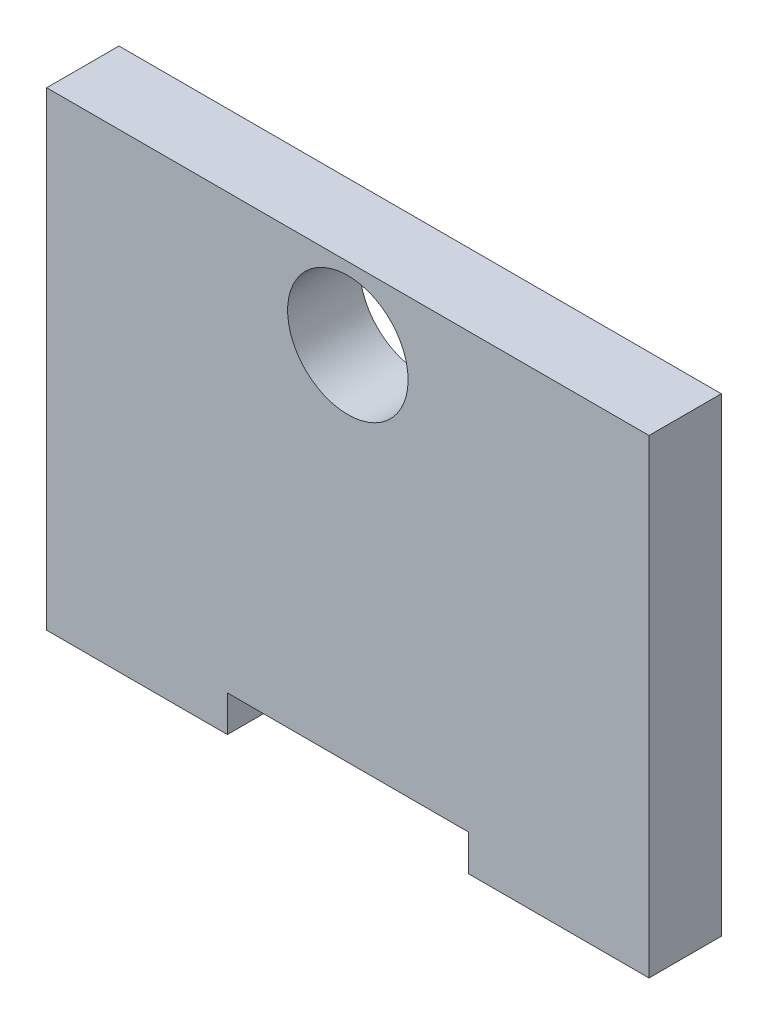
ISO-10303-21;
HEADER;
FILE_DESCRIPTION(('STEP AP214'),'2;1');
FILE_NAME('part.step','',(''),(''),'','','');
FILE_SCHEMA(('AUTOMOTIVE_DESIGN { 1 0 10303 214 1 1 1 1 }'));
ENDSEC;
DATA;
#1=APPLICATION_CONTEXT('core data for automotive mechanical design processes');
#2=APPLICATION_PROTOCOL_DEFINITION('international standard','automotive_design',2000,#1);
#3=PRODUCT_CONTEXT('',#1,'mechanical');
#4=PRODUCT('Part','Part','',(#3));
#5=PRODUCT_RELATED_PRODUCT_CATEGORY('part','',(#4));
#6=PRODUCT_DEFINITION_FORMATION('','',#4);
#7=PRODUCT_DEFINITION_CONTEXT('part definition',#1,'design');
#8=PRODUCT_DEFINITION('design','',#6,#7);
#9=PRODUCT_DEFINITION_SHAPE('','',#8);
#10=(LENGTH_UNIT() NAMED_UNIT(*) SI_UNIT(.MILLI.,.METRE.));
#11=(NAMED_UNIT(*) PLANE_ANGLE_UNIT() SI_UNIT($,.RADIAN.));
#12=(NAMED_UNIT(*) SI_UNIT($,.STERADIAN.) SOLID_ANGLE_UNIT());
#13=UNCERTAINTY_MEASURE_WITH_UNIT(LENGTH_MEASURE(1.E-05),#10,'distance_accuracy_value','');
#14=(GEOMETRIC_REPRESENTATION_CONTEXT(3) GLOBAL_UNCERTAINTY_ASSIGNED_CONTEXT((#13)) GLOBAL_UNIT_ASSIGNED_CONTEXT((#10,
#11,#12)) REPRESENTATION_CONTEXT('',''));
#15=CARTESIAN_POINT('',(0.,0.,0.));
#16=DIRECTION('',(0.,0.,1.));
#17=DIRECTION('',(1.,0.,0.));
#18=AXIS2_PLACEMENT_3D('',#15,#16,#17);
#19=CARTESIAN_POINT('',(0.,0.,6.));
#20=DIRECTION('',(0.,0.,1.));
#21=DIRECTION('',(1.,0.,0.));
#22=AXIS2_PLACEMENT_3D('',#19,#20,#21);
#23=PLANE('',#22);
#24=DIRECTION('',(0.,-1.,0.));
#25=VECTOR('',#24,1.);
#26=CARTESIAN_POINT('',(0.,0.,6.));
#27=LINE('',#26,#25);
#28=CARTESIAN_POINT('',(0.,36.,6.));
#29=VERTEX_POINT('',#28);
#30=CARTESIAN_POINT('',(0.,-3.,6.));
#31=VERTEX_POINT('',#30);
#32=EDGE_CURVE('E59',#29,#31,#27,.T.);
#33=ORIENTED_EDGE('',*,*,#32,.T.);
#34=DIRECTION('',(1.,0.,0.));
#35=VECTOR('',#34,1.);
#36=CARTESIAN_POINT('',(0.,-3.,6.));
#37=LINE('',#36,#35);
#38=CARTESIAN_POINT('',(15.,-3.,6.));
#39=VERTEX_POINT('',#38);
#40=EDGE_CURVE('E102',#31,#39,#37,.T.);
#41=ORIENTED_EDGE('',*,*,#40,.T.);
#42=DIRECTION('',(0.,1.,0.));
#43=VECTOR('',#42,1.);
#44=CARTESIAN_POINT('',(15.,0.,6.));
#45=LINE('',#44,#43);
#46=CARTESIAN_POINT('',(15.,0.,6.));
#47=VERTEX_POINT('',#46);
#48=EDGE_CURVE('E189',#39,#47,#45,.T.);
#49=ORIENTED_EDGE('',*,*,#48,.T.);
#50=DIRECTION('',(1.,0.,0.));
#51=VECTOR('',#50,1.);
#52=CARTESIAN_POINT('',(15.,0.,6.));
#53=LINE('',#52,#51);
#54=CARTESIAN_POINT('',(35.,0.,6.));
#55=VERTEX_POINT('',#54);
#56=EDGE_CURVE('E204',#47,#55,#53,.T.);
#57=ORIENTED_EDGE('',*,*,#56,.T.);
#58=DIRECTION('',(0.,-1.,0.));
#59=VECTOR('',#58,1.);
#60=CARTESIAN_POINT('',(35.,0.,6.));
#61=LINE('',#60,#59);
#62=CARTESIAN_POINT('',(35.,-3.,6.));
#63=VERTEX_POINT('',#62);
#64=EDGE_CURVE('E122',#55,#63,#61,.T.);
#65=ORIENTED_EDGE('',*,*,#64,.T.);
#66=DIRECTION('',(1.,0.,0.));
#67=VECTOR('',#66,1.);
#68=CARTESIAN_POINT('',(50.,-2.99999999999999,6.));
#69=LINE('',#68,#67);
#70=CARTESIAN_POINT('',(50.,-2.99999999999999,6.));
#71=VERTEX_POINT('',#70);
#72=EDGE_CURVE('E116',#63,#71,#69,.T.);
#73=ORIENTED_EDGE('',*,*,#72,.T.);
#74=DIRECTION('',(0.,1.,0.));
#75=VECTOR('',#74,1.);
#76=CARTESIAN_POINT('',(50.,0.,6.));
#77=LINE('',#76,#75);
#78=CARTESIAN_POINT('',(50.,36.,6.));
#79=VERTEX_POINT('',#78);
#80=EDGE_CURVE('E120',#71,#79,#77,.T.);
#81=ORIENTED_EDGE('',*,*,#80,.T.);
#82=DIRECTION('',(-1.,0.,0.));
#83=VECTOR('',#82,1.);
#84=CARTESIAN_POINT('',(50.,36.,6.));
#85=LINE('',#84,#83);
#86=EDGE_CURVE('E140',#79,#29,#85,.T.);
#87=ORIENTED_EDGE('',*,*,#86,.T.);
#88=EDGE_LOOP('',(#33,#41,#49,#57,#65,#73,#81,#87));
#89=FACE_BOUND('',#88,.T.);
#90=CARTESIAN_POINT('',(25.,30.,6.));
#91=DIRECTION('',(0.,0.,1.));
#92=DIRECTION('',(1.,0.,0.));
#93=AXIS2_PLACEMENT_3D('',#90,#91,#92);
#94=CIRCLE('',#93,5.);
#95=CARTESIAN_POINT('',(30.,30.,6.));
#96=VERTEX_POINT('',#95);
#97=EDGE_CURVE('E151',#96,#96,#94,.T.);
#98=ORIENTED_EDGE('',*,*,#97,.F.);
#99=EDGE_LOOP('',(#98));
#100=FACE_BOUND('',#99,.T.);
#101=ADVANCED_FACE('F41',(#89,#100),#23,.T.);
#102=CARTESIAN_POINT('',(0.,0.,0.));
#103=DIRECTION('',(0.,0.,1.));
#104=DIRECTION('',(1.,0.,0.));
#105=AXIS2_PLACEMENT_3D('',#102,#103,#104);
#106=PLANE('',#105);
#107=DIRECTION('',(1.,0.,0.));
#108=VECTOR('',#107,1.);
#109=CARTESIAN_POINT('',(0.,-3.,0.));
#110=LINE('',#109,#108);
#111=CARTESIAN_POINT('',(0.,-3.,0.));
#112=VERTEX_POINT('',#111);
#113=CARTESIAN_POINT('',(15.,-3.,0.));
#114=VERTEX_POINT('',#113);
#115=EDGE_CURVE('E147',#112,#114,#110,.T.);
#116=ORIENTED_EDGE('',*,*,#115,.F.);
#117=DIRECTION('',(0.,-1.,0.));
#118=VECTOR('',#117,1.);
#119=CARTESIAN_POINT('',(0.,36.,0.));
#120=LINE('',#119,#118);
#121=CARTESIAN_POINT('',(0.,36.,0.));
#122=VERTEX_POINT('',#121);
#123=EDGE_CURVE('E166',#122,#112,#120,.T.);
#124=ORIENTED_EDGE('',*,*,#123,.F.);
#125=DIRECTION('',(-1.,0.,0.));
#126=VECTOR('',#125,1.);
#127=CARTESIAN_POINT('',(50.,36.,0.));
#128=LINE('',#127,#126);
#129=CARTESIAN_POINT('',(50.,36.,0.));
#130=VERTEX_POINT('',#129);
#131=EDGE_CURVE('E95',#130,#122,#128,.T.);
#132=ORIENTED_EDGE('',*,*,#131,.F.);
#133=DIRECTION('',(0.,1.,0.));
#134=VECTOR('',#133,1.);
#135=CARTESIAN_POINT('',(50.,0.,0.));
#136=LINE('',#135,#134);
#137=CARTESIAN_POINT('',(50.,-2.99999999999999,0.));
#138=VERTEX_POINT('',#137);
#139=EDGE_CURVE('E88',#138,#130,#136,.T.);
#140=ORIENTED_EDGE('',*,*,#139,.F.);
#141=DIRECTION('',(1.,0.,0.));
#142=VECTOR('',#141,1.);
#143=CARTESIAN_POINT('',(50.,-2.99999999999999,0.));
#144=LINE('',#143,#142);
#145=CARTESIAN_POINT('',(35.,-3.,0.));
#146=VERTEX_POINT('',#145);
#147=EDGE_CURVE('E132',#146,#138,#144,.T.);
#148=ORIENTED_EDGE('',*,*,#147,.F.);
#149=DIRECTION('',(0.,-1.,0.));
#150=VECTOR('',#149,1.);
#151=CARTESIAN_POINT('',(35.,0.,0.));
#152=LINE('',#151,#150);
#153=CARTESIAN_POINT('',(35.,0.,0.));
#154=VERTEX_POINT('',#153);
#155=EDGE_CURVE('E157',#154,#146,#152,.T.);
#156=ORIENTED_EDGE('',*,*,#155,.F.);
#157=DIRECTION('',(1.,0.,0.));
#158=VECTOR('',#157,1.);
#159=CARTESIAN_POINT('',(15.,0.,0.));
#160=LINE('',#159,#158);
#161=CARTESIAN_POINT('',(15.,0.,0.));
#162=VERTEX_POINT('',#161);
#163=EDGE_CURVE('E154',#162,#154,#160,.T.);
#164=ORIENTED_EDGE('',*,*,#163,.F.);
#165=DIRECTION('',(0.,1.,0.));
#166=VECTOR('',#165,1.);
#167=CARTESIAN_POINT('',(15.,0.,0.));
#168=LINE('',#167,#166);
#169=EDGE_CURVE('E150',#114,#162,#168,.T.);
#170=ORIENTED_EDGE('',*,*,#169,.F.);
#171=EDGE_LOOP('',(#116,#124,#132,#140,#148,#156,#164,#170));
#172=FACE_BOUND('',#171,.T.);
#173=CARTESIAN_POINT('',(25.,30.,0.));
#174=DIRECTION('',(0.,0.,1.));
#175=DIRECTION('',(1.,0.,0.));
#176=AXIS2_PLACEMENT_3D('',#173,#174,#175);
#177=CIRCLE('',#176,5.);
#178=CARTESIAN_POINT('',(30.,30.,0.));
#179=VERTEX_POINT('',#178);
#180=EDGE_CURVE('E214',#179,#179,#177,.T.);
#181=ORIENTED_EDGE('',*,*,#180,.T.);
#182=EDGE_LOOP('',(#181));
#183=FACE_BOUND('',#182,.T.);
#184=ADVANCED_FACE('F193',(#172,#183),#106,.F.);
#185=CARTESIAN_POINT('',(0.,-3.,6.));
#186=DIRECTION('',(0.,1.,0.));
#187=DIRECTION('',(0.,0.,1.));
#188=AXIS2_PLACEMENT_3D('',#185,#186,#187);
#189=PLANE('',#188);
#190=ORIENTED_EDGE('',*,*,#115,.T.);
#191=DIRECTION('',(0.,0.,-1.));
#192=VECTOR('',#191,1.);
#193=CARTESIAN_POINT('',(15.,-3.,6.));
#194=LINE('',#193,#192);
#195=EDGE_CURVE('E51',#39,#114,#194,.T.);
#196=ORIENTED_EDGE('',*,*,#195,.F.);
#197=ORIENTED_EDGE('',*,*,#40,.F.);
#198=DIRECTION('',(0.,0.,-1.));
#199=VECTOR('',#198,1.);
#200=CARTESIAN_POINT('',(0.,-3.,6.));
#201=LINE('',#200,#199);
#202=EDGE_CURVE('E11',#31,#112,#201,.T.);
#203=ORIENTED_EDGE('',*,*,#202,.T.);
#204=EDGE_LOOP('',(#190,#196,#197,#203));
#205=FACE_BOUND('',#204,.T.);
#206=ADVANCED_FACE('F43',(#205),#189,.F.);
#207=CARTESIAN_POINT('',(15.,0.,6.));
#208=DIRECTION('',(-1.,0.,0.));
#209=DIRECTION('',(0.,0.,1.));
#210=AXIS2_PLACEMENT_3D('',#207,#208,#209);
#211=PLANE('',#210);
#212=ORIENTED_EDGE('',*,*,#169,.T.);
#213=DIRECTION('',(0.,0.,-1.));
#214=VECTOR('',#213,1.);
#215=CARTESIAN_POINT('',(15.,0.,6.));
#216=LINE('',#215,#214);
#217=EDGE_CURVE('E179',#47,#162,#216,.T.);
#218=ORIENTED_EDGE('',*,*,#217,.F.);
#219=ORIENTED_EDGE('',*,*,#48,.F.);
#220=ORIENTED_EDGE('',*,*,#195,.T.);
#221=EDGE_LOOP('',(#212,#218,#219,#220));
#222=FACE_BOUND('',#221,.T.);
#223=ADVANCED_FACE('F187',(#222),#211,.F.);
#224=CARTESIAN_POINT('',(15.,0.,6.));
#225=DIRECTION('',(0.,1.,0.));
#226=DIRECTION('',(0.,0.,1.));
#227=AXIS2_PLACEMENT_3D('',#224,#225,#226);
#228=PLANE('',#227);
#229=ORIENTED_EDGE('',*,*,#163,.T.);
#230=DIRECTION('',(0.,0.,-1.));
#231=VECTOR('',#230,1.);
#232=CARTESIAN_POINT('',(35.,0.,6.));
#233=LINE('',#232,#231);
#234=EDGE_CURVE('E175',#55,#154,#233,.T.);
#235=ORIENTED_EDGE('',*,*,#234,.F.);
#236=ORIENTED_EDGE('',*,*,#56,.F.);
#237=ORIENTED_EDGE('',*,*,#217,.T.);
#238=EDGE_LOOP('',(#229,#235,#236,#237));
#239=FACE_BOUND('',#238,.T.);
#240=ADVANCED_FACE('F199',(#239),#228,.F.);
#241=CARTESIAN_POINT('',(35.,0.,6.));
#242=DIRECTION('',(1.,0.,0.));
#243=DIRECTION('',(0.,0.,-1.));
#244=AXIS2_PLACEMENT_3D('',#241,#242,#243);
#245=PLANE('',#244);
#246=ORIENTED_EDGE('',*,*,#155,.T.);
#247=DIRECTION('',(0.,0.,-1.));
#248=VECTOR('',#247,1.);
#249=CARTESIAN_POINT('',(35.,-3.,6.));
#250=LINE('',#249,#248);
#251=EDGE_CURVE('E134',#63,#146,#250,.T.);
#252=ORIENTED_EDGE('',*,*,#251,.F.);
#253=ORIENTED_EDGE('',*,*,#64,.F.);
#254=ORIENTED_EDGE('',*,*,#234,.T.);
#255=EDGE_LOOP('',(#246,#252,#253,#254));
#256=FACE_BOUND('',#255,.T.);
#257=ADVANCED_FACE('F202',(#256),#245,.F.);
#258=CARTESIAN_POINT('',(50.,-2.99999999999999,6.));
#259=DIRECTION('',(0.,1.,0.));
#260=DIRECTION('',(-1.,0.,0.));
#261=AXIS2_PLACEMENT_3D('',#258,#259,#260);
#262=PLANE('',#261);
#263=ORIENTED_EDGE('',*,*,#147,.T.);
#264=DIRECTION('',(0.,0.,-1.));
#265=VECTOR('',#264,1.);
#266=CARTESIAN_POINT('',(50.,-2.99999999999999,6.));
#267=LINE('',#266,#265);
#268=EDGE_CURVE('E129',#71,#138,#267,.T.);
#269=ORIENTED_EDGE('',*,*,#268,.F.);
#270=ORIENTED_EDGE('',*,*,#72,.F.);
#271=ORIENTED_EDGE('',*,*,#251,.T.);
#272=EDGE_LOOP('',(#263,#269,#270,#271));
#273=FACE_BOUND('',#272,.T.);
#274=ADVANCED_FACE('F130',(#273),#262,.F.);
#275=CARTESIAN_POINT('',(50.,0.,6.));
#276=DIRECTION('',(-1.,0.,0.));
#277=DIRECTION('',(0.,0.,1.));
#278=AXIS2_PLACEMENT_3D('',#275,#276,#277);
#279=PLANE('',#278);
#280=ORIENTED_EDGE('',*,*,#139,.T.);
#281=DIRECTION('',(0.,0.,-1.));
#282=VECTOR('',#281,1.);
#283=CARTESIAN_POINT('',(50.,36.,6.));
#284=LINE('',#283,#282);
#285=EDGE_CURVE('E135',#79,#130,#284,.T.);
#286=ORIENTED_EDGE('',*,*,#285,.F.);
#287=ORIENTED_EDGE('',*,*,#80,.F.);
#288=ORIENTED_EDGE('',*,*,#268,.T.);
#289=EDGE_LOOP('',(#280,#286,#287,#288));
#290=FACE_BOUND('',#289,.T.);
#291=ADVANCED_FACE('F137',(#290),#279,.F.);
#292=CARTESIAN_POINT('',(50.,36.,6.));
#293=DIRECTION('',(0.,-1.,0.));
#294=DIRECTION('',(1.,0.,0.));
#295=AXIS2_PLACEMENT_3D('',#292,#293,#294);
#296=PLANE('',#295);
#297=ORIENTED_EDGE('',*,*,#131,.T.);
#298=DIRECTION('',(0.,0.,-1.));
#299=VECTOR('',#298,1.);
#300=CARTESIAN_POINT('',(0.,36.,6.));
#301=LINE('',#300,#299);
#302=EDGE_CURVE('E143',#29,#122,#301,.T.);
#303=ORIENTED_EDGE('',*,*,#302,.F.);
#304=ORIENTED_EDGE('',*,*,#86,.F.);
#305=ORIENTED_EDGE('',*,*,#285,.T.);
#306=EDGE_LOOP('',(#297,#303,#304,#305));
#307=FACE_BOUND('',#306,.T.);
#308=ADVANCED_FACE('F235',(#307),#296,.F.);
#309=CARTESIAN_POINT('',(0.,36.,6.));
#310=DIRECTION('',(1.,0.,0.));
#311=DIRECTION('',(0.,0.,-1.));
#312=AXIS2_PLACEMENT_3D('',#309,#310,#311);
#313=PLANE('',#312);
#314=ORIENTED_EDGE('',*,*,#123,.T.);
#315=ORIENTED_EDGE('',*,*,#202,.F.);
#316=ORIENTED_EDGE('',*,*,#32,.F.);
#317=ORIENTED_EDGE('',*,*,#302,.T.);
#318=EDGE_LOOP('',(#314,#315,#316,#317));
#319=FACE_BOUND('',#318,.T.);
#320=ADVANCED_FACE('F232',(#319),#313,.F.);
#321=CARTESIAN_POINT('',(25.,30.,6.));
#322=DIRECTION('',(0.,0.,-1.));
#323=DIRECTION('',(-1.,0.,0.));
#324=AXIS2_PLACEMENT_3D('',#321,#322,#323);
#325=CYLINDRICAL_SURFACE('',#324,5.);
#326=ORIENTED_EDGE('',*,*,#97,.T.);
#327=EDGE_LOOP('',(#326));
#328=FACE_BOUND('',#327,.T.);
#329=ORIENTED_EDGE('',*,*,#180,.F.);
#330=EDGE_LOOP('',(#329));
#331=FACE_BOUND('',#330,.T.);
#332=ADVANCED_FACE('F222',(#328,#331),#325,.F.);
#333=CLOSED_SHELL('',(#101,#184,#206,#223,#240,#257,#274,#291,#308,#320,#332));
#334=MANIFOLD_SOLID_BREP('B2',#333);
#335=ADVANCED_BREP_SHAPE_REPRESENTATION('',(#18,#334),#14);
#336=SHAPE_DEFINITION_REPRESENTATION(#9,#335);
ENDSEC;
END-ISO-10303-21;
